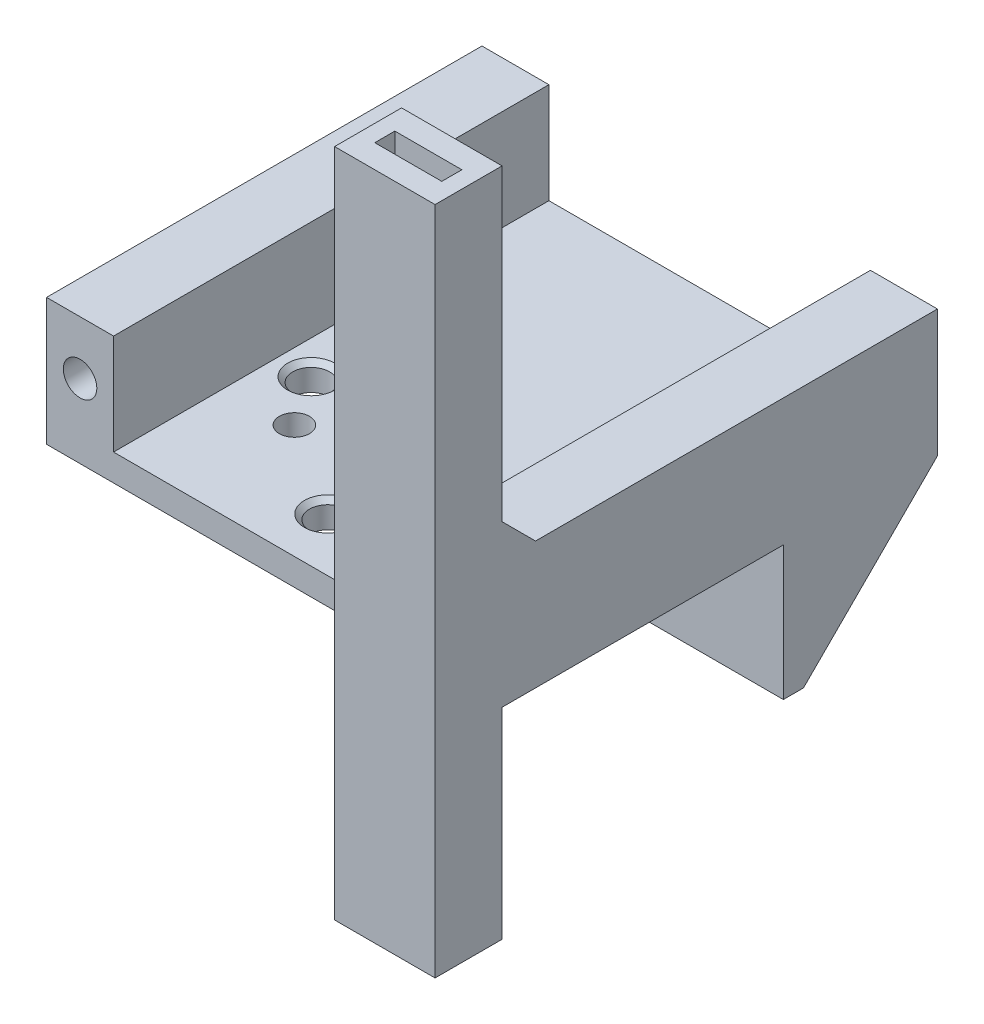
ISO-10303-21;
HEADER;
FILE_DESCRIPTION(('STEP AP214'),'2;1');
FILE_NAME('part.step','',(''),(''),'','','');
FILE_SCHEMA(('AUTOMOTIVE_DESIGN { 1 0 10303 214 1 1 1 1 }'));
ENDSEC;
DATA;
#1=APPLICATION_CONTEXT('core data for automotive mechanical design processes');
#2=APPLICATION_PROTOCOL_DEFINITION('international standard','automotive_design',2000,#1);
#3=PRODUCT_CONTEXT('',#1,'mechanical');
#4=PRODUCT('Part','Part','',(#3));
#5=PRODUCT_RELATED_PRODUCT_CATEGORY('part','',(#4));
#6=PRODUCT_DEFINITION_FORMATION('','',#4);
#7=PRODUCT_DEFINITION_CONTEXT('part definition',#1,'design');
#8=PRODUCT_DEFINITION('design','',#6,#7);
#9=PRODUCT_DEFINITION_SHAPE('','',#8);
#10=(LENGTH_UNIT() NAMED_UNIT(*) SI_UNIT(.MILLI.,.METRE.));
#11=(NAMED_UNIT(*) PLANE_ANGLE_UNIT() SI_UNIT($,.RADIAN.));
#12=(NAMED_UNIT(*) SI_UNIT($,.STERADIAN.) SOLID_ANGLE_UNIT());
#13=UNCERTAINTY_MEASURE_WITH_UNIT(LENGTH_MEASURE(1.E-05),#10,'distance_accuracy_value','');
#14=(GEOMETRIC_REPRESENTATION_CONTEXT(3) GLOBAL_UNCERTAINTY_ASSIGNED_CONTEXT((#13)) GLOBAL_UNIT_ASSIGNED_CONTEXT((#10,
#11,#12)) REPRESENTATION_CONTEXT('',''));
#15=CARTESIAN_POINT('',(0.,0.,0.));
#16=DIRECTION('',(0.,0.,1.));
#17=DIRECTION('',(1.,0.,0.));
#18=AXIS2_PLACEMENT_3D('',#15,#16,#17);
#19=CARTESIAN_POINT('',(-24.,19.,-40.));
#20=DIRECTION('',(-1.,0.,0.));
#21=DIRECTION('',(0.,0.,1.));
#22=AXIS2_PLACEMENT_3D('',#19,#20,#21);
#23=PLANE('',#22);
#24=DIRECTION('',(0.,0.,-1.));
#25=VECTOR('',#24,1.);
#26=CARTESIAN_POINT('',(-24.,4.,-40.));
#27=LINE('',#26,#25);
#28=CARTESIAN_POINT('',(-24.,4.,2.));
#29=VERTEX_POINT('',#28);
#30=CARTESIAN_POINT('',(-24.,4.,-63.));
#31=VERTEX_POINT('',#30);
#32=EDGE_CURVE('E56',#29,#31,#27,.T.);
#33=ORIENTED_EDGE('',*,*,#32,.T.);
#34=DIRECTION('',(0.,-1.,0.));
#35=VECTOR('',#34,1.);
#36=CARTESIAN_POINT('',(-24.,19.,-63.));
#37=LINE('',#36,#35);
#38=CARTESIAN_POINT('',(-24.,19.,-63.));
#39=VERTEX_POINT('',#38);
#40=EDGE_CURVE('E220',#39,#31,#37,.T.);
#41=ORIENTED_EDGE('',*,*,#40,.F.);
#42=DIRECTION('',(0.,0.,-1.));
#43=VECTOR('',#42,1.);
#44=CARTESIAN_POINT('',(-24.,19.,-40.));
#45=LINE('',#44,#43);
#46=CARTESIAN_POINT('',(-24.,19.,2.00000000000001));
#47=VERTEX_POINT('',#46);
#48=EDGE_CURVE('E318',#47,#39,#45,.T.);
#49=ORIENTED_EDGE('',*,*,#48,.F.);
#50=DIRECTION('',(0.,-1.,0.));
#51=VECTOR('',#50,1.);
#52=CARTESIAN_POINT('',(-24.,19.,2.00000000000001));
#53=LINE('',#52,#51);
#54=EDGE_CURVE('E320',#47,#29,#53,.T.);
#55=ORIENTED_EDGE('',*,*,#54,.T.);
#56=EDGE_LOOP('',(#33,#41,#49,#55));
#57=FACE_BOUND('',#56,.T.);
#58=ADVANCED_FACE('F33',(#57),#23,.F.);
#59=CARTESIAN_POINT('',(24.,19.,-40.));
#60=DIRECTION('',(1.,0.,0.));
#61=DIRECTION('',(0.,0.,-1.));
#62=AXIS2_PLACEMENT_3D('',#59,#60,#61);
#63=PLANE('',#62);
#64=DIRECTION('',(0.,1.,0.));
#65=VECTOR('',#64,1.);
#66=CARTESIAN_POINT('',(24.,19.,-63.));
#67=LINE('',#66,#65);
#68=CARTESIAN_POINT('',(24.,4.,-63.));
#69=VERTEX_POINT('',#68);
#70=CARTESIAN_POINT('',(24.,19.,-63.));
#71=VERTEX_POINT('',#70);
#72=EDGE_CURVE('E230',#69,#71,#67,.T.);
#73=ORIENTED_EDGE('',*,*,#72,.F.);
#74=DIRECTION('',(0.,0.,1.));
#75=VECTOR('',#74,1.);
#76=CARTESIAN_POINT('',(24.,4.,-40.));
#77=LINE('',#76,#75);
#78=CARTESIAN_POINT('',(24.,4.,-3.));
#79=VERTEX_POINT('',#78);
#80=EDGE_CURVE('E48',#69,#79,#77,.T.);
#81=ORIENTED_EDGE('',*,*,#80,.T.);
#82=DIRECTION('',(0.,1.,0.));
#83=VECTOR('',#82,1.);
#84=CARTESIAN_POINT('',(24.,19.,-3.));
#85=LINE('',#84,#83);
#86=CARTESIAN_POINT('',(24.,19.,-3.));
#87=VERTEX_POINT('',#86);
#88=EDGE_CURVE('E381',#79,#87,#85,.T.);
#89=ORIENTED_EDGE('',*,*,#88,.T.);
#90=DIRECTION('',(0.,0.,1.));
#91=VECTOR('',#90,1.);
#92=CARTESIAN_POINT('',(24.,19.,-40.));
#93=LINE('',#92,#91);
#94=EDGE_CURVE('E311',#71,#87,#93,.T.);
#95=ORIENTED_EDGE('',*,*,#94,.F.);
#96=EDGE_LOOP('',(#73,#81,#89,#95));
#97=FACE_BOUND('',#96,.T.);
#98=ADVANCED_FACE('F421',(#97),#63,.F.);
#99=CARTESIAN_POINT('',(19.,-30.,2.));
#100=DIRECTION('',(1.,0.,0.));
#101=DIRECTION('',(0.,0.,-1.));
#102=AXIS2_PLACEMENT_3D('',#99,#100,#101);
#103=PLANE('',#102);
#104=DIRECTION('',(0.,1.,0.));
#105=VECTOR('',#104,1.);
#106=CARTESIAN_POINT('',(19.,-30.,2.));
#107=LINE('',#106,#105);
#108=CARTESIAN_POINT('',(19.,4.,2.));
#109=VERTEX_POINT('',#108);
#110=CARTESIAN_POINT('',(19.,24.,2.));
#111=VERTEX_POINT('',#110);
#112=EDGE_CURVE('E296',#109,#111,#107,.T.);
#113=ORIENTED_EDGE('',*,*,#112,.F.);
#114=DIRECTION('',(0.,0.,1.));
#115=VECTOR('',#114,1.);
#116=CARTESIAN_POINT('',(19.,4.,0.));
#117=LINE('',#116,#115);
#118=CARTESIAN_POINT('',(19.,4.,12.));
#119=VERTEX_POINT('',#118);
#120=EDGE_CURVE('E389',#109,#119,#117,.T.);
#121=ORIENTED_EDGE('',*,*,#120,.T.);
#122=DIRECTION('',(0.,1.,0.));
#123=VECTOR('',#122,1.);
#124=CARTESIAN_POINT('',(19.,-30.,12.));
#125=LINE('',#124,#123);
#126=CARTESIAN_POINT('',(19.,70.,12.));
#127=VERTEX_POINT('',#126);
#128=EDGE_CURVE('E295',#119,#127,#125,.T.);
#129=ORIENTED_EDGE('',*,*,#128,.T.);
#130=DIRECTION('',(0.,0.,-1.));
#131=VECTOR('',#130,1.);
#132=CARTESIAN_POINT('',(19.,70.,2.));
#133=LINE('',#132,#131);
#134=CARTESIAN_POINT('',(19.,70.,2.));
#135=VERTEX_POINT('',#134);
#136=EDGE_CURVE('E272',#127,#135,#133,.T.);
#137=ORIENTED_EDGE('',*,*,#136,.T.);
#138=EDGE_CURVE('E291',#111,#135,#107,.T.);
#139=ORIENTED_EDGE('',*,*,#138,.F.);
#140=EDGE_LOOP('',(#113,#121,#129,#137,#139));
#141=FACE_BOUND('',#140,.T.);
#142=ADVANCED_FACE('F471',(#141),#103,.F.);
#143=CARTESIAN_POINT('',(0.,0.,0.));
#144=DIRECTION('',(0.,-1.,0.));
#145=DIRECTION('',(0.,0.,-1.));
#146=AXIS2_PLACEMENT_3D('',#143,#144,#145);
#147=PLANE('',#146);
#148=CARTESIAN_POINT('',(-14.,0.,-15.));
#149=DIRECTION('',(0.,1.,0.));
#150=DIRECTION('',(0.,0.,1.));
#151=AXIS2_PLACEMENT_3D('',#148,#149,#150);
#152=CIRCLE('',#151,2.25);
#153=CARTESIAN_POINT('',(-14.,0.,-12.75));
#154=VERTEX_POINT('',#153);
#155=EDGE_CURVE('E327',#154,#154,#152,.T.);
#156=ORIENTED_EDGE('',*,*,#155,.T.);
#157=EDGE_LOOP('',(#156));
#158=FACE_BOUND('',#157,.T.);
#159=CARTESIAN_POINT('',(19.,0.,-22.5));
#160=DIRECTION('',(0.,1.,0.));
#161=DIRECTION('',(0.,0.,1.));
#162=AXIS2_PLACEMENT_3D('',#159,#160,#161);
#163=CIRCLE('',#162,2.75);
#164=CARTESIAN_POINT('',(19.,0.,-19.75));
#165=VERTEX_POINT('',#164);
#166=EDGE_CURVE('E338',#165,#165,#163,.T.);
#167=ORIENTED_EDGE('',*,*,#166,.T.);
#168=EDGE_LOOP('',(#167));
#169=FACE_BOUND('',#168,.T.);
#170=CARTESIAN_POINT('',(-19.,0.,-22.5));
#171=DIRECTION('',(0.,1.,0.));
#172=DIRECTION('',(0.,0.,1.));
#173=AXIS2_PLACEMENT_3D('',#170,#171,#172);
#174=CIRCLE('',#173,2.75);
#175=CARTESIAN_POINT('',(-19.,0.,-19.75));
#176=VERTEX_POINT('',#175);
#177=EDGE_CURVE('E341',#176,#176,#174,.T.);
#178=ORIENTED_EDGE('',*,*,#177,.T.);
#179=EDGE_LOOP('',(#178));
#180=FACE_BOUND('',#179,.T.);
#181=CARTESIAN_POINT('',(0.,0.,-6.));
#182=DIRECTION('',(0.,1.,0.));
#183=DIRECTION('',(0.,0.,1.));
#184=AXIS2_PLACEMENT_3D('',#181,#182,#183);
#185=CIRCLE('',#184,2.75);
#186=CARTESIAN_POINT('',(0.,0.,-3.25));
#187=VERTEX_POINT('',#186);
#188=EDGE_CURVE('E333',#187,#187,#185,.T.);
#189=ORIENTED_EDGE('',*,*,#188,.T.);
#190=EDGE_LOOP('',(#189));
#191=FACE_BOUND('',#190,.T.);
#192=CARTESIAN_POINT('',(14.,0.,-15.));
#193=DIRECTION('',(0.,1.,0.));
#194=DIRECTION('',(0.,0.,1.));
#195=AXIS2_PLACEMENT_3D('',#192,#193,#194);
#196=CIRCLE('',#195,2.25);
#197=CARTESIAN_POINT('',(14.,0.,-12.75));
#198=VERTEX_POINT('',#197);
#199=EDGE_CURVE('E323',#198,#198,#196,.T.);
#200=ORIENTED_EDGE('',*,*,#199,.T.);
#201=EDGE_LOOP('',(#200));
#202=FACE_BOUND('',#201,.T.);
#203=DIRECTION('',(0.,0.,1.));
#204=VECTOR('',#203,1.);
#205=CARTESIAN_POINT('',(-34.,0.,0.));
#206=LINE('',#205,#204);
#207=CARTESIAN_POINT('',(-34.,0.,-40.));
#208=VERTEX_POINT('',#207);
#209=CARTESIAN_POINT('',(-34.,0.,2.));
#210=VERTEX_POINT('',#209);
#211=EDGE_CURVE('E351',#208,#210,#206,.T.);
#212=ORIENTED_EDGE('',*,*,#211,.F.);
#213=DIRECTION('',(-1.,0.,0.));
#214=VECTOR('',#213,1.);
#215=CARTESIAN_POINT('',(-34.,0.,-40.));
#216=LINE('',#215,#214);
#217=CARTESIAN_POINT('',(34.,0.,-40.));
#218=VERTEX_POINT('',#217);
#219=EDGE_CURVE('E344',#218,#208,#216,.T.);
#220=ORIENTED_EDGE('',*,*,#219,.F.);
#221=DIRECTION('',(0.,0.,-1.));
#222=VECTOR('',#221,1.);
#223=CARTESIAN_POINT('',(34.,0.,2.));
#224=LINE('',#223,#222);
#225=CARTESIAN_POINT('',(34.,0.,2.));
#226=VERTEX_POINT('',#225);
#227=EDGE_CURVE('E349',#226,#218,#224,.T.);
#228=ORIENTED_EDGE('',*,*,#227,.F.);
#229=DIRECTION('',(1.,0.,0.));
#230=VECTOR('',#229,1.);
#231=CARTESIAN_POINT('',(-34.,0.,2.));
#232=LINE('',#231,#230);
#233=CARTESIAN_POINT('',(19.,0.,2.));
#234=VERTEX_POINT('',#233);
#235=EDGE_CURVE('E353',#234,#226,#232,.T.);
#236=ORIENTED_EDGE('',*,*,#235,.F.);
#237=DIRECTION('',(0.,0.,-1.));
#238=VECTOR('',#237,1.);
#239=CARTESIAN_POINT('',(19.,0.,2.));
#240=LINE('',#239,#238);
#241=CARTESIAN_POINT('',(19.,0.,12.));
#242=VERTEX_POINT('',#241);
#243=EDGE_CURVE('E387',#242,#234,#240,.T.);
#244=ORIENTED_EDGE('',*,*,#243,.F.);
#245=DIRECTION('',(0.707106781186551,0.,0.707106781186544));
#246=VECTOR('',#245,1.);
#247=CARTESIAN_POINT('',(8.99999999999994,0.,2.));
#248=LINE('',#247,#246);
#249=CARTESIAN_POINT('',(8.99999999999994,0.,2.));
#250=VERTEX_POINT('',#249);
#251=EDGE_CURVE('E394',#242,#250,#248,.F.);
#252=ORIENTED_EDGE('',*,*,#251,.T.);
#253=EDGE_CURVE('E354',#210,#250,#232,.T.);
#254=ORIENTED_EDGE('',*,*,#253,.F.);
#255=EDGE_LOOP('',(#212,#220,#228,#236,#244,#252,#254));
#256=FACE_BOUND('',#255,.T.);
#257=ADVANCED_FACE('F498',(#158,#169,#180,#191,#202,#256),#147,.T.);
#258=CARTESIAN_POINT('',(0.,4.,0.));
#259=DIRECTION('',(0.,-1.,0.));
#260=DIRECTION('',(0.,0.,-1.));
#261=AXIS2_PLACEMENT_3D('',#258,#259,#260);
#262=PLANE('',#261);
#263=CARTESIAN_POINT('',(0.,4.,-6.));
#264=DIRECTION('',(0.,-1.,0.));
#265=DIRECTION('',(0.,0.,-1.));
#266=AXIS2_PLACEMENT_3D('',#263,#264,#265);
#267=CIRCLE('',#266,3.5);
#268=CARTESIAN_POINT('',(0.,4.,-9.5));
#269=VERTEX_POINT('',#268);
#270=EDGE_CURVE('E370',#269,#269,#267,.T.);
#271=ORIENTED_EDGE('',*,*,#270,.T.);
#272=EDGE_LOOP('',(#271));
#273=FACE_BOUND('',#272,.T.);
#274=CARTESIAN_POINT('',(-19.,4.,-22.5));
#275=DIRECTION('',(0.,-1.,0.));
#276=DIRECTION('',(0.,0.,-1.));
#277=AXIS2_PLACEMENT_3D('',#274,#275,#276);
#278=CIRCLE('',#277,3.5);
#279=CARTESIAN_POINT('',(-19.,4.,-26.));
#280=VERTEX_POINT('',#279);
#281=EDGE_CURVE('E367',#280,#280,#278,.T.);
#282=ORIENTED_EDGE('',*,*,#281,.T.);
#283=EDGE_LOOP('',(#282));
#284=FACE_BOUND('',#283,.T.);
#285=CARTESIAN_POINT('',(19.,4.,-22.5));
#286=DIRECTION('',(0.,-1.,0.));
#287=DIRECTION('',(0.,0.,-1.));
#288=AXIS2_PLACEMENT_3D('',#285,#286,#287);
#289=CIRCLE('',#288,3.5);
#290=CARTESIAN_POINT('',(19.,4.,-26.));
#291=VERTEX_POINT('',#290);
#292=EDGE_CURVE('E364',#291,#291,#289,.T.);
#293=ORIENTED_EDGE('',*,*,#292,.T.);
#294=EDGE_LOOP('',(#293));
#295=FACE_BOUND('',#294,.T.);
#296=CARTESIAN_POINT('',(-14.,4.,-15.));
#297=DIRECTION('',(0.,1.,0.));
#298=DIRECTION('',(0.,0.,1.));
#299=AXIS2_PLACEMENT_3D('',#296,#297,#298);
#300=CIRCLE('',#299,2.25);
#301=CARTESIAN_POINT('',(-14.,4.,-12.75));
#302=VERTEX_POINT('',#301);
#303=EDGE_CURVE('E330',#302,#302,#300,.T.);
#304=ORIENTED_EDGE('',*,*,#303,.F.);
#305=EDGE_LOOP('',(#304));
#306=FACE_BOUND('',#305,.T.);
#307=CARTESIAN_POINT('',(14.,4.,-15.));
#308=DIRECTION('',(0.,1.,0.));
#309=DIRECTION('',(0.,0.,1.));
#310=AXIS2_PLACEMENT_3D('',#307,#308,#309);
#311=CIRCLE('',#310,2.25);
#312=CARTESIAN_POINT('',(14.,4.,-12.75));
#313=VERTEX_POINT('',#312);
#314=EDGE_CURVE('E324',#313,#313,#311,.T.);
#315=ORIENTED_EDGE('',*,*,#314,.F.);
#316=EDGE_LOOP('',(#315));
#317=FACE_BOUND('',#316,.T.);
#318=DIRECTION('',(1.,0.,0.));
#319=VECTOR('',#318,1.);
#320=CARTESIAN_POINT('',(-34.,4.,2.));
#321=LINE('',#320,#319);
#322=CARTESIAN_POINT('',(8.99999999999994,4.,2.));
#323=VERTEX_POINT('',#322);
#324=EDGE_CURVE('E345',#29,#323,#321,.T.);
#325=ORIENTED_EDGE('',*,*,#324,.T.);
#326=DIRECTION('',(-0.707106781186551,0.,-0.707106781186544));
#327=VECTOR('',#326,1.);
#328=CARTESIAN_POINT('',(3.49999999999992,4.,-3.49999999999996));
#329=LINE('',#328,#327);
#330=EDGE_CURVE('E392',#323,#119,#329,.F.);
#331=ORIENTED_EDGE('',*,*,#330,.T.);
#332=ORIENTED_EDGE('',*,*,#120,.F.);
#333=DIRECTION('',(-0.707106781186551,0.,0.707106781186544));
#334=VECTOR('',#333,1.);
#335=CARTESIAN_POINT('',(19.,4.,2.));
#336=LINE('',#335,#334);
#337=EDGE_CURVE('E379',#109,#79,#336,.F.);
#338=ORIENTED_EDGE('',*,*,#337,.T.);
#339=ORIENTED_EDGE('',*,*,#80,.F.);
#340=DIRECTION('',(1.,0.,0.));
#341=VECTOR('',#340,1.);
#342=CARTESIAN_POINT('',(-34.002,4.,-63.));
#343=LINE('',#342,#341);
#344=EDGE_CURVE('E428',#31,#69,#343,.T.);
#345=ORIENTED_EDGE('',*,*,#344,.F.);
#346=ORIENTED_EDGE('',*,*,#32,.F.);
#347=EDGE_LOOP('',(#325,#331,#332,#338,#339,#345,#346));
#348=FACE_BOUND('',#347,.T.);
#349=ADVANCED_FACE('F496',(#273,#284,#295,#306,#317,#348),#262,.F.);
#350=CARTESIAN_POINT('',(-34.,4.,0.));
#351=DIRECTION('',(1.,0.,0.));
#352=DIRECTION('',(0.,0.,-1.));
#353=AXIS2_PLACEMENT_3D('',#350,#351,#352);
#354=PLANE('',#353);
#355=DIRECTION('',(0.,1.,0.));
#356=VECTOR('',#355,1.);
#357=CARTESIAN_POINT('',(-34.,19.,-63.));
#358=LINE('',#357,#356);
#359=CARTESIAN_POINT('',(-34.,0.,-63.));
#360=VERTEX_POINT('',#359);
#361=CARTESIAN_POINT('',(-34.,19.,-63.));
#362=VERTEX_POINT('',#361);
#363=EDGE_CURVE('E195',#360,#362,#358,.T.);
#364=ORIENTED_EDGE('',*,*,#363,.F.);
#365=DIRECTION('',(0.,-0.707106781186548,0.707106781186547));
#366=VECTOR('',#365,1.);
#367=CARTESIAN_POINT('',(-34.,0.,-63.));
#368=LINE('',#367,#366);
#369=CARTESIAN_POINT('',(-34.,-20.,-43.));
#370=VERTEX_POINT('',#369);
#371=EDGE_CURVE('E206',#360,#370,#368,.T.);
#372=ORIENTED_EDGE('',*,*,#371,.T.);
#373=DIRECTION('',(0.,0.,1.));
#374=VECTOR('',#373,1.);
#375=CARTESIAN_POINT('',(-34.,-20.,-43.));
#376=LINE('',#375,#374);
#377=CARTESIAN_POINT('',(-34.,-20.,-40.));
#378=VERTEX_POINT('',#377);
#379=EDGE_CURVE('E433',#370,#378,#376,.T.);
#380=ORIENTED_EDGE('',*,*,#379,.T.);
#381=DIRECTION('',(0.,1.,0.));
#382=VECTOR('',#381,1.);
#383=CARTESIAN_POINT('',(-34.,0.,-40.));
#384=LINE('',#383,#382);
#385=EDGE_CURVE('E434',#378,#208,#384,.T.);
#386=ORIENTED_EDGE('',*,*,#385,.T.);
#387=ORIENTED_EDGE('',*,*,#211,.T.);
#388=DIRECTION('',(0.,-1.,0.));
#389=VECTOR('',#388,1.);
#390=CARTESIAN_POINT('',(-34.,4.,2.));
#391=LINE('',#390,#389);
#392=CARTESIAN_POINT('',(-34.,19.,2.));
#393=VERTEX_POINT('',#392);
#394=EDGE_CURVE('E348',#393,#210,#391,.T.);
#395=ORIENTED_EDGE('',*,*,#394,.F.);
#396=DIRECTION('',(0.,0.,1.));
#397=VECTOR('',#396,1.);
#398=CARTESIAN_POINT('',(-34.,19.,-40.));
#399=LINE('',#398,#397);
#400=EDGE_CURVE('E218',#362,#393,#399,.T.);
#401=ORIENTED_EDGE('',*,*,#400,.F.);
#402=EDGE_LOOP('',(#364,#372,#380,#386,#387,#395,#401));
#403=FACE_BOUND('',#402,.T.);
#404=ADVANCED_FACE('F216',(#403),#354,.F.);
#405=CARTESIAN_POINT('',(-34.,4.,2.));
#406=DIRECTION('',(0.,0.,-1.));
#407=DIRECTION('',(-1.,0.,0.));
#408=AXIS2_PLACEMENT_3D('',#405,#406,#407);
#409=PLANE('',#408);
#410=CARTESIAN_POINT('',(-29.,11.,2.));
#411=DIRECTION('',(0.,0.,-1.));
#412=DIRECTION('',(-1.,0.,0.));
#413=AXIS2_PLACEMENT_3D('',#410,#411,#412);
#414=CIRCLE('',#413,2.49999999999999);
#415=CARTESIAN_POINT('',(-31.5,11.,2.));
#416=VERTEX_POINT('',#415);
#417=EDGE_CURVE('E303',#416,#416,#414,.T.);
#418=ORIENTED_EDGE('',*,*,#417,.T.);
#419=EDGE_LOOP('',(#418));
#420=FACE_BOUND('',#419,.T.);
#421=ORIENTED_EDGE('',*,*,#253,.T.);
#422=DIRECTION('',(0.,1.,0.));
#423=VECTOR('',#422,1.);
#424=CARTESIAN_POINT('',(8.99999999999994,4.,2.));
#425=LINE('',#424,#423);
#426=EDGE_CURVE('E384',#250,#323,#425,.T.);
#427=ORIENTED_EDGE('',*,*,#426,.T.);
#428=ORIENTED_EDGE('',*,*,#324,.F.);
#429=ORIENTED_EDGE('',*,*,#54,.F.);
#430=DIRECTION('',(1.,0.,0.));
#431=VECTOR('',#430,1.);
#432=CARTESIAN_POINT('',(-34.,19.,2.));
#433=LINE('',#432,#431);
#434=EDGE_CURVE('E316',#393,#47,#433,.T.);
#435=ORIENTED_EDGE('',*,*,#434,.F.);
#436=ORIENTED_EDGE('',*,*,#394,.T.);
#437=EDGE_LOOP('',(#421,#427,#428,#429,#435,#436));
#438=FACE_BOUND('',#437,.T.);
#439=ADVANCED_FACE('F505',(#420,#438),#409,.F.);
#440=CARTESIAN_POINT('',(34.,4.,2.));
#441=DIRECTION('',(-1.,0.,0.));
#442=DIRECTION('',(0.,0.,1.));
#443=AXIS2_PLACEMENT_3D('',#440,#441,#442);
#444=PLANE('',#443);
#445=DIRECTION('',(0.,0.707106781186548,-0.707106781186547));
#446=VECTOR('',#445,1.);
#447=CARTESIAN_POINT('',(34.,-20.,-43.));
#448=LINE('',#447,#446);
#449=CARTESIAN_POINT('',(34.,-20.,-43.));
#450=VERTEX_POINT('',#449);
#451=CARTESIAN_POINT('',(34.,0.,-63.));
#452=VERTEX_POINT('',#451);
#453=EDGE_CURVE('E214',#450,#452,#448,.T.);
#454=ORIENTED_EDGE('',*,*,#453,.T.);
#455=DIRECTION('',(0.,-1.,0.));
#456=VECTOR('',#455,1.);
#457=CARTESIAN_POINT('',(34.,19.,-63.));
#458=LINE('',#457,#456);
#459=CARTESIAN_POINT('',(34.,19.,-63.));
#460=VERTEX_POINT('',#459);
#461=EDGE_CURVE('E199',#460,#452,#458,.T.);
#462=ORIENTED_EDGE('',*,*,#461,.F.);
#463=DIRECTION('',(0.,0.,-1.));
#464=VECTOR('',#463,1.);
#465=CARTESIAN_POINT('',(34.,19.,-40.));
#466=LINE('',#465,#464);
#467=CARTESIAN_POINT('',(34.,19.,-3.00000000000003));
#468=VERTEX_POINT('',#467);
#469=EDGE_CURVE('E309',#468,#460,#466,.T.);
#470=ORIENTED_EDGE('',*,*,#469,.F.);
#471=DIRECTION('',(0.,-0.707106781186544,-0.707106781186551));
#472=VECTOR('',#471,1.);
#473=CARTESIAN_POINT('',(34.,14.0000000000001,-7.99999999999999));
#474=LINE('',#473,#472);
#475=CARTESIAN_POINT('',(34.,24.,2.));
#476=VERTEX_POINT('',#475);
#477=EDGE_CURVE('E41',#468,#476,#474,.F.);
#478=ORIENTED_EDGE('',*,*,#477,.T.);
#479=DIRECTION('',(0.,1.,0.));
#480=VECTOR('',#479,1.);
#481=CARTESIAN_POINT('',(34.,-30.,2.));
#482=LINE('',#481,#480);
#483=CARTESIAN_POINT('',(34.,70.,2.));
#484=VERTEX_POINT('',#483);
#485=EDGE_CURVE('E287',#476,#484,#482,.T.);
#486=ORIENTED_EDGE('',*,*,#485,.T.);
#487=DIRECTION('',(0.,0.,1.));
#488=VECTOR('',#487,1.);
#489=CARTESIAN_POINT('',(34.,70.,2.));
#490=LINE('',#489,#488);
#491=CARTESIAN_POINT('',(34.,70.,12.));
#492=VERTEX_POINT('',#491);
#493=EDGE_CURVE('E260',#484,#492,#490,.T.);
#494=ORIENTED_EDGE('',*,*,#493,.T.);
#495=DIRECTION('',(0.,1.,0.));
#496=VECTOR('',#495,1.);
#497=CARTESIAN_POINT('',(34.,-30.,12.));
#498=LINE('',#497,#496);
#499=CARTESIAN_POINT('',(34.,-30.,12.));
#500=VERTEX_POINT('',#499);
#501=EDGE_CURVE('E300',#500,#492,#498,.T.);
#502=ORIENTED_EDGE('',*,*,#501,.F.);
#503=DIRECTION('',(0.,0.,1.));
#504=VECTOR('',#503,1.);
#505=CARTESIAN_POINT('',(34.,-30.,2.));
#506=LINE('',#505,#504);
#507=CARTESIAN_POINT('',(34.,-30.,2.));
#508=VERTEX_POINT('',#507);
#509=EDGE_CURVE('E278',#508,#500,#506,.T.);
#510=ORIENTED_EDGE('',*,*,#509,.F.);
#511=EDGE_CURVE('E288',#508,#226,#482,.T.);
#512=ORIENTED_EDGE('',*,*,#511,.T.);
#513=ORIENTED_EDGE('',*,*,#227,.T.);
#514=DIRECTION('',(0.,-1.,0.));
#515=VECTOR('',#514,1.);
#516=CARTESIAN_POINT('',(34.,-20.,-40.));
#517=LINE('',#516,#515);
#518=CARTESIAN_POINT('',(34.,-20.,-40.));
#519=VERTEX_POINT('',#518);
#520=EDGE_CURVE('E213',#218,#519,#517,.T.);
#521=ORIENTED_EDGE('',*,*,#520,.T.);
#522=DIRECTION('',(0.,0.,1.));
#523=VECTOR('',#522,1.);
#524=CARTESIAN_POINT('',(34.,-20.,-43.));
#525=LINE('',#524,#523);
#526=EDGE_CURVE('E427',#450,#519,#525,.T.);
#527=ORIENTED_EDGE('',*,*,#526,.F.);
#528=EDGE_LOOP('',(#454,#462,#470,#478,#486,#494,#502,#510,#512,#513,#521,#527));
#529=FACE_BOUND('',#528,.T.);
#530=ADVANCED_FACE('F404',(#529),#444,.F.);
#531=CARTESIAN_POINT('',(-19.,4.,-22.5));
#532=DIRECTION('',(0.,-1.,0.));
#533=DIRECTION('',(0.,0.,-1.));
#534=AXIS2_PLACEMENT_3D('',#531,#532,#533);
#535=CYLINDRICAL_SURFACE('',#534,2.75);
#536=CARTESIAN_POINT('',(-19.,3.25000000000001,-22.5));
#537=DIRECTION('',(0.,-1.,0.));
#538=DIRECTION('',(0.,0.,-1.));
#539=AXIS2_PLACEMENT_3D('',#536,#537,#538);
#540=CIRCLE('',#539,2.75);
#541=CARTESIAN_POINT('',(-19.,3.25000000000001,-25.25));
#542=VERTEX_POINT('',#541);
#543=EDGE_CURVE('E373',#542,#542,#540,.F.);
#544=ORIENTED_EDGE('',*,*,#543,.T.);
#545=EDGE_LOOP('',(#544));
#546=FACE_BOUND('',#545,.T.);
#547=ORIENTED_EDGE('',*,*,#177,.F.);
#548=EDGE_LOOP('',(#547));
#549=FACE_BOUND('',#548,.T.);
#550=ADVANCED_FACE('F491',(#546,#549),#535,.F.);
#551=CARTESIAN_POINT('',(19.,4.,-22.5));
#552=DIRECTION('',(0.,-1.,0.));
#553=DIRECTION('',(0.,0.,-1.));
#554=AXIS2_PLACEMENT_3D('',#551,#552,#553);
#555=CYLINDRICAL_SURFACE('',#554,2.75);
#556=CARTESIAN_POINT('',(19.,3.25000000000001,-22.5));
#557=DIRECTION('',(0.,-1.,0.));
#558=DIRECTION('',(0.,0.,-1.));
#559=AXIS2_PLACEMENT_3D('',#556,#557,#558);
#560=CIRCLE('',#559,2.75);
#561=CARTESIAN_POINT('',(19.,3.25000000000001,-25.25));
#562=VERTEX_POINT('',#561);
#563=EDGE_CURVE('E376',#562,#562,#560,.F.);
#564=ORIENTED_EDGE('',*,*,#563,.T.);
#565=EDGE_LOOP('',(#564));
#566=FACE_BOUND('',#565,.T.);
#567=ORIENTED_EDGE('',*,*,#166,.F.);
#568=EDGE_LOOP('',(#567));
#569=FACE_BOUND('',#568,.T.);
#570=ADVANCED_FACE('F487',(#566,#569),#555,.F.);
#571=CARTESIAN_POINT('',(0.,4.,-6.));
#572=DIRECTION('',(0.,-1.,0.));
#573=DIRECTION('',(0.,0.,-1.));
#574=AXIS2_PLACEMENT_3D('',#571,#572,#573);
#575=CYLINDRICAL_SURFACE('',#574,2.75);
#576=CARTESIAN_POINT('',(0.,3.25000000000002,-6.));
#577=DIRECTION('',(0.,-1.,0.));
#578=DIRECTION('',(0.,0.,-1.));
#579=AXIS2_PLACEMENT_3D('',#576,#577,#578);
#580=CIRCLE('',#579,2.75);
#581=CARTESIAN_POINT('',(0.,3.25000000000002,-8.75));
#582=VERTEX_POINT('',#581);
#583=EDGE_CURVE('E361',#582,#582,#580,.F.);
#584=ORIENTED_EDGE('',*,*,#583,.T.);
#585=EDGE_LOOP('',(#584));
#586=FACE_BOUND('',#585,.T.);
#587=ORIENTED_EDGE('',*,*,#188,.F.);
#588=EDGE_LOOP('',(#587));
#589=FACE_BOUND('',#588,.T.);
#590=ADVANCED_FACE('F483',(#586,#589),#575,.F.);
#591=CARTESIAN_POINT('',(-14.,4.,-15.));
#592=DIRECTION('',(0.,-1.,0.));
#593=DIRECTION('',(0.,0.,-1.));
#594=AXIS2_PLACEMENT_3D('',#591,#592,#593);
#595=CYLINDRICAL_SURFACE('',#594,2.25);
#596=ORIENTED_EDGE('',*,*,#303,.T.);
#597=EDGE_LOOP('',(#596));
#598=FACE_BOUND('',#597,.T.);
#599=ORIENTED_EDGE('',*,*,#155,.F.);
#600=EDGE_LOOP('',(#599));
#601=FACE_BOUND('',#600,.T.);
#602=ADVANCED_FACE('F479',(#598,#601),#595,.F.);
#603=CARTESIAN_POINT('',(14.,4.,-15.));
#604=DIRECTION('',(0.,-1.,0.));
#605=DIRECTION('',(0.,0.,-1.));
#606=AXIS2_PLACEMENT_3D('',#603,#604,#605);
#607=CYLINDRICAL_SURFACE('',#606,2.25);
#608=ORIENTED_EDGE('',*,*,#314,.T.);
#609=EDGE_LOOP('',(#608));
#610=FACE_BOUND('',#609,.T.);
#611=ORIENTED_EDGE('',*,*,#199,.F.);
#612=EDGE_LOOP('',(#611));
#613=FACE_BOUND('',#612,.T.);
#614=ADVANCED_FACE('F476',(#610,#613),#607,.F.);
#615=CARTESIAN_POINT('',(0.,19.,0.));
#616=DIRECTION('',(0.,1.,0.));
#617=DIRECTION('',(0.,0.,1.));
#618=AXIS2_PLACEMENT_3D('',#615,#616,#617);
#619=PLANE('',#618);
#620=ORIENTED_EDGE('',*,*,#400,.T.);
#621=ORIENTED_EDGE('',*,*,#434,.T.);
#622=ORIENTED_EDGE('',*,*,#48,.T.);
#623=DIRECTION('',(1.,0.,0.));
#624=VECTOR('',#623,1.);
#625=CARTESIAN_POINT('',(-24.,19.,-63.));
#626=LINE('',#625,#624);
#627=EDGE_CURVE('E219',#362,#39,#626,.T.);
#628=ORIENTED_EDGE('',*,*,#627,.F.);
#629=EDGE_LOOP('',(#620,#621,#622,#628));
#630=FACE_BOUND('',#629,.T.);
#631=ADVANCED_FACE('F475',(#630),#619,.T.);
#632=CARTESIAN_POINT('',(0.,19.,0.));
#633=DIRECTION('',(0.,-1.,0.));
#634=DIRECTION('',(0.,0.,-1.));
#635=AXIS2_PLACEMENT_3D('',#632,#633,#634);
#636=PLANE('',#635);
#637=ORIENTED_EDGE('',*,*,#94,.T.);
#638=DIRECTION('',(1.,0.,0.));
#639=VECTOR('',#638,1.);
#640=CARTESIAN_POINT('',(34.,19.,-3.00000000000003));
#641=LINE('',#640,#639);
#642=EDGE_CURVE('E396',#87,#468,#641,.T.);
#643=ORIENTED_EDGE('',*,*,#642,.T.);
#644=ORIENTED_EDGE('',*,*,#469,.T.);
#645=DIRECTION('',(1.,0.,0.));
#646=VECTOR('',#645,1.);
#647=CARTESIAN_POINT('',(24.,19.,-63.));
#648=LINE('',#647,#646);
#649=EDGE_CURVE('E232',#71,#460,#648,.T.);
#650=ORIENTED_EDGE('',*,*,#649,.F.);
#651=EDGE_LOOP('',(#637,#643,#644,#650));
#652=FACE_BOUND('',#651,.T.);
#653=ADVANCED_FACE('F424',(#652),#636,.F.);
#654=CARTESIAN_POINT('',(-29.,11.,2.));
#655=DIRECTION('',(0.,0.,-1.));
#656=DIRECTION('',(-1.,0.,0.));
#657=AXIS2_PLACEMENT_3D('',#654,#655,#656);
#658=CYLINDRICAL_SURFACE('',#657,2.49999999999999);
#659=ORIENTED_EDGE('',*,*,#417,.F.);
#660=EDGE_LOOP('',(#659));
#661=FACE_BOUND('',#660,.T.);
#662=CARTESIAN_POINT('',(-29.,11.,-63.));
#663=DIRECTION('',(0.,0.,-1.));
#664=DIRECTION('',(-1.,0.,0.));
#665=AXIS2_PLACEMENT_3D('',#662,#663,#664);
#666=CIRCLE('',#665,2.49999999999999);
#667=CARTESIAN_POINT('',(-31.5,11.,-63.));
#668=VERTEX_POINT('',#667);
#669=EDGE_CURVE('E224',#668,#668,#666,.T.);
#670=ORIENTED_EDGE('',*,*,#669,.T.);
#671=EDGE_LOOP('',(#670));
#672=FACE_BOUND('',#671,.T.);
#673=ADVANCED_FACE('F444',(#661,#672),#658,.F.);
#674=CARTESIAN_POINT('',(0.,3.25000000000002,-6.));
#675=DIRECTION('',(0.,1.,0.));
#676=DIRECTION('',(0.,0.,1.));
#677=AXIS2_PLACEMENT_3D('',#674,#675,#676);
#678=CONICAL_SURFACE('',#677,2.75,0.785398163397457);
#679=ORIENTED_EDGE('',*,*,#270,.F.);
#680=EDGE_LOOP('',(#679));
#681=FACE_BOUND('',#680,.T.);
#682=ORIENTED_EDGE('',*,*,#583,.F.);
#683=EDGE_LOOP('',(#682));
#684=FACE_BOUND('',#683,.T.);
#685=ADVANCED_FACE('F511',(#681,#684),#678,.F.);
#686=CARTESIAN_POINT('',(-19.,3.25000000000001,-22.5));
#687=DIRECTION('',(0.,1.,0.));
#688=DIRECTION('',(0.,0.,1.));
#689=AXIS2_PLACEMENT_3D('',#686,#687,#688);
#690=CONICAL_SURFACE('',#689,2.75,0.785398163397456);
#691=ORIENTED_EDGE('',*,*,#281,.F.);
#692=EDGE_LOOP('',(#691));
#693=FACE_BOUND('',#692,.T.);
#694=ORIENTED_EDGE('',*,*,#543,.F.);
#695=EDGE_LOOP('',(#694));
#696=FACE_BOUND('',#695,.T.);
#697=ADVANCED_FACE('F514',(#693,#696),#690,.F.);
#698=CARTESIAN_POINT('',(19.,3.25000000000001,-22.5));
#699=DIRECTION('',(0.,1.,0.));
#700=DIRECTION('',(0.,0.,1.));
#701=AXIS2_PLACEMENT_3D('',#698,#699,#700);
#702=CONICAL_SURFACE('',#701,2.75,0.785398163397456);
#703=ORIENTED_EDGE('',*,*,#292,.F.);
#704=EDGE_LOOP('',(#703));
#705=FACE_BOUND('',#704,.T.);
#706=ORIENTED_EDGE('',*,*,#563,.F.);
#707=EDGE_LOOP('',(#706));
#708=FACE_BOUND('',#707,.T.);
#709=ADVANCED_FACE('F518',(#705,#708),#702,.F.);
#710=CARTESIAN_POINT('',(0.,70.,0.));
#711=DIRECTION('',(0.,-1.,0.));
#712=DIRECTION('',(0.,0.,-1.));
#713=AXIS2_PLACEMENT_3D('',#710,#711,#712);
#714=PLANE('',#713);
#715=DIRECTION('',(-1.,0.,0.));
#716=VECTOR('',#715,1.);
#717=CARTESIAN_POINT('',(21.5,70.,5.5));
#718=LINE('',#717,#716);
#719=CARTESIAN_POINT('',(31.5,70.,5.5));
#720=VERTEX_POINT('',#719);
#721=CARTESIAN_POINT('',(21.5,70.,5.5));
#722=VERTEX_POINT('',#721);
#723=EDGE_CURVE('E250',#720,#722,#718,.T.);
#724=ORIENTED_EDGE('',*,*,#723,.F.);
#725=DIRECTION('',(0.,0.,-1.));
#726=VECTOR('',#725,1.);
#727=CARTESIAN_POINT('',(31.5,70.,5.5));
#728=LINE('',#727,#726);
#729=CARTESIAN_POINT('',(31.5,70.,8.5));
#730=VERTEX_POINT('',#729);
#731=EDGE_CURVE('E203',#730,#720,#728,.T.);
#732=ORIENTED_EDGE('',*,*,#731,.F.);
#733=DIRECTION('',(1.,0.,0.));
#734=VECTOR('',#733,1.);
#735=CARTESIAN_POINT('',(21.5,70.,8.5));
#736=LINE('',#735,#734);
#737=CARTESIAN_POINT('',(21.5,70.,8.5));
#738=VERTEX_POINT('',#737);
#739=EDGE_CURVE('E239',#738,#730,#736,.T.);
#740=ORIENTED_EDGE('',*,*,#739,.F.);
#741=DIRECTION('',(0.,0.,1.));
#742=VECTOR('',#741,1.);
#743=CARTESIAN_POINT('',(21.5,70.,5.5));
#744=LINE('',#743,#742);
#745=EDGE_CURVE('E253',#722,#738,#744,.T.);
#746=ORIENTED_EDGE('',*,*,#745,.F.);
#747=EDGE_LOOP('',(#724,#732,#740,#746));
#748=FACE_BOUND('',#747,.T.);
#749=ORIENTED_EDGE('',*,*,#493,.F.);
#750=DIRECTION('',(1.,0.,0.));
#751=VECTOR('',#750,1.);
#752=CARTESIAN_POINT('',(34.,70.,2.));
#753=LINE('',#752,#751);
#754=EDGE_CURVE('E275',#135,#484,#753,.T.);
#755=ORIENTED_EDGE('',*,*,#754,.F.);
#756=ORIENTED_EDGE('',*,*,#136,.F.);
#757=DIRECTION('',(-1.,0.,0.));
#758=VECTOR('',#757,1.);
#759=CARTESIAN_POINT('',(34.,70.,12.));
#760=LINE('',#759,#758);
#761=EDGE_CURVE('E269',#492,#127,#760,.T.);
#762=ORIENTED_EDGE('',*,*,#761,.F.);
#763=EDGE_LOOP('',(#749,#755,#756,#762));
#764=FACE_BOUND('',#763,.T.);
#765=ADVANCED_FACE('F522',(#748,#764),#714,.F.);
#766=CARTESIAN_POINT('',(0.,-30.,0.));
#767=DIRECTION('',(0.,-1.,0.));
#768=DIRECTION('',(0.,0.,-1.));
#769=AXIS2_PLACEMENT_3D('',#766,#767,#768);
#770=PLANE('',#769);
#771=DIRECTION('',(0.,0.,-1.));
#772=VECTOR('',#771,1.);
#773=CARTESIAN_POINT('',(31.5,-30.,5.5));
#774=LINE('',#773,#772);
#775=CARTESIAN_POINT('',(31.5,-30.,8.5));
#776=VERTEX_POINT('',#775);
#777=CARTESIAN_POINT('',(31.5,-30.,5.5));
#778=VERTEX_POINT('',#777);
#779=EDGE_CURVE('E235',#776,#778,#774,.T.);
#780=ORIENTED_EDGE('',*,*,#779,.T.);
#781=DIRECTION('',(-1.,0.,0.));
#782=VECTOR('',#781,1.);
#783=CARTESIAN_POINT('',(21.5,-30.,5.5));
#784=LINE('',#783,#782);
#785=CARTESIAN_POINT('',(21.5,-30.,5.5));
#786=VERTEX_POINT('',#785);
#787=EDGE_CURVE('E238',#778,#786,#784,.T.);
#788=ORIENTED_EDGE('',*,*,#787,.T.);
#789=DIRECTION('',(0.,0.,1.));
#790=VECTOR('',#789,1.);
#791=CARTESIAN_POINT('',(21.5,-30.,5.5));
#792=LINE('',#791,#790);
#793=CARTESIAN_POINT('',(21.5,-30.,8.5));
#794=VERTEX_POINT('',#793);
#795=EDGE_CURVE('E242',#786,#794,#792,.T.);
#796=ORIENTED_EDGE('',*,*,#795,.T.);
#797=DIRECTION('',(1.,0.,0.));
#798=VECTOR('',#797,1.);
#799=CARTESIAN_POINT('',(21.5,-30.,8.5));
#800=LINE('',#799,#798);
#801=EDGE_CURVE('E245',#794,#776,#800,.T.);
#802=ORIENTED_EDGE('',*,*,#801,.T.);
#803=EDGE_LOOP('',(#780,#788,#796,#802));
#804=FACE_BOUND('',#803,.T.);
#805=ORIENTED_EDGE('',*,*,#509,.T.);
#806=DIRECTION('',(-1.,0.,0.));
#807=VECTOR('',#806,1.);
#808=CARTESIAN_POINT('',(34.,-30.,12.));
#809=LINE('',#808,#807);
#810=CARTESIAN_POINT('',(19.,-30.,12.));
#811=VERTEX_POINT('',#810);
#812=EDGE_CURVE('E281',#500,#811,#809,.T.);
#813=ORIENTED_EDGE('',*,*,#812,.T.);
#814=DIRECTION('',(0.,0.,-1.));
#815=VECTOR('',#814,1.);
#816=CARTESIAN_POINT('',(19.,-30.,2.));
#817=LINE('',#816,#815);
#818=CARTESIAN_POINT('',(19.,-30.,2.));
#819=VERTEX_POINT('',#818);
#820=EDGE_CURVE('E283',#811,#819,#817,.T.);
#821=ORIENTED_EDGE('',*,*,#820,.T.);
#822=DIRECTION('',(1.,0.,0.));
#823=VECTOR('',#822,1.);
#824=CARTESIAN_POINT('',(34.,-30.,2.));
#825=LINE('',#824,#823);
#826=EDGE_CURVE('E285',#819,#508,#825,.T.);
#827=ORIENTED_EDGE('',*,*,#826,.T.);
#828=EDGE_LOOP('',(#805,#813,#821,#827));
#829=FACE_BOUND('',#828,.T.);
#830=ADVANCED_FACE('F567',(#804,#829),#770,.T.);
#831=CARTESIAN_POINT('',(34.,-30.,2.));
#832=DIRECTION('',(0.,0.,1.));
#833=DIRECTION('',(1.,0.,0.));
#834=AXIS2_PLACEMENT_3D('',#831,#832,#833);
#835=PLANE('',#834);
#836=ORIENTED_EDGE('',*,*,#485,.F.);
#837=DIRECTION('',(-1.,0.,0.));
#838=VECTOR('',#837,1.);
#839=CARTESIAN_POINT('',(19.,24.,2.));
#840=LINE('',#839,#838);
#841=EDGE_CURVE('E399',#476,#111,#840,.T.);
#842=ORIENTED_EDGE('',*,*,#841,.T.);
#843=ORIENTED_EDGE('',*,*,#138,.T.);
#844=ORIENTED_EDGE('',*,*,#754,.T.);
#845=EDGE_LOOP('',(#836,#842,#843,#844));
#846=FACE_BOUND('',#845,.T.);
#847=ADVANCED_FACE('F410',(#846),#835,.F.);
#848=EDGE_CURVE('E297',#811,#242,#125,.T.);
#849=ORIENTED_EDGE('',*,*,#848,.T.);
#850=ORIENTED_EDGE('',*,*,#243,.T.);
#851=EDGE_CURVE('E292',#819,#234,#107,.T.);
#852=ORIENTED_EDGE('',*,*,#851,.F.);
#853=ORIENTED_EDGE('',*,*,#820,.F.);
#854=EDGE_LOOP('',(#849,#850,#852,#853));
#855=FACE_BOUND('',#854,.T.);
#856=ADVANCED_FACE('F557',(#855),#103,.F.);
#857=CARTESIAN_POINT('',(34.,-30.,12.));
#858=DIRECTION('',(0.,0.,-1.));
#859=DIRECTION('',(-1.,0.,0.));
#860=AXIS2_PLACEMENT_3D('',#857,#858,#859);
#861=PLANE('',#860);
#862=ORIENTED_EDGE('',*,*,#501,.T.);
#863=ORIENTED_EDGE('',*,*,#761,.T.);
#864=ORIENTED_EDGE('',*,*,#128,.F.);
#865=EDGE_CURVE('E301',#242,#119,#125,.T.);
#866=ORIENTED_EDGE('',*,*,#865,.F.);
#867=ORIENTED_EDGE('',*,*,#848,.F.);
#868=ORIENTED_EDGE('',*,*,#812,.F.);
#869=EDGE_LOOP('',(#862,#863,#864,#866,#867,#868));
#870=FACE_BOUND('',#869,.T.);
#871=ADVANCED_FACE('F560',(#870),#861,.F.);
#872=ORIENTED_EDGE('',*,*,#851,.T.);
#873=ORIENTED_EDGE('',*,*,#235,.T.);
#874=ORIENTED_EDGE('',*,*,#511,.F.);
#875=ORIENTED_EDGE('',*,*,#826,.F.);
#876=EDGE_LOOP('',(#872,#873,#874,#875));
#877=FACE_BOUND('',#876,.T.);
#878=ADVANCED_FACE('F458',(#877),#835,.F.);
#879=CARTESIAN_POINT('',(31.5,-30.,5.5));
#880=DIRECTION('',(1.,0.,0.));
#881=DIRECTION('',(0.,0.,-1.));
#882=AXIS2_PLACEMENT_3D('',#879,#880,#881);
#883=PLANE('',#882);
#884=ORIENTED_EDGE('',*,*,#731,.T.);
#885=DIRECTION('',(0.,1.,0.));
#886=VECTOR('',#885,1.);
#887=CARTESIAN_POINT('',(31.5,-30.,5.5));
#888=LINE('',#887,#886);
#889=EDGE_CURVE('E248',#778,#720,#888,.T.);
#890=ORIENTED_EDGE('',*,*,#889,.F.);
#891=ORIENTED_EDGE('',*,*,#779,.F.);
#892=DIRECTION('',(0.,1.,0.));
#893=VECTOR('',#892,1.);
#894=CARTESIAN_POINT('',(31.5,-30.,8.5));
#895=LINE('',#894,#893);
#896=EDGE_CURVE('E258',#776,#730,#895,.T.);
#897=ORIENTED_EDGE('',*,*,#896,.T.);
#898=EDGE_LOOP('',(#884,#890,#891,#897));
#899=FACE_BOUND('',#898,.T.);
#900=ADVANCED_FACE('F577',(#899),#883,.F.);
#901=CARTESIAN_POINT('',(21.5,-30.,8.5));
#902=DIRECTION('',(0.,0.,1.));
#903=DIRECTION('',(1.,0.,0.));
#904=AXIS2_PLACEMENT_3D('',#901,#902,#903);
#905=PLANE('',#904);
#906=ORIENTED_EDGE('',*,*,#739,.T.);
#907=ORIENTED_EDGE('',*,*,#896,.F.);
#908=ORIENTED_EDGE('',*,*,#801,.F.);
#909=DIRECTION('',(0.,1.,0.));
#910=VECTOR('',#909,1.);
#911=CARTESIAN_POINT('',(21.5,-30.,8.5));
#912=LINE('',#911,#910);
#913=EDGE_CURVE('E261',#794,#738,#912,.T.);
#914=ORIENTED_EDGE('',*,*,#913,.T.);
#915=EDGE_LOOP('',(#906,#907,#908,#914));
#916=FACE_BOUND('',#915,.T.);
#917=ADVANCED_FACE('F687',(#916),#905,.F.);
#918=CARTESIAN_POINT('',(21.5,-30.,5.5));
#919=DIRECTION('',(-1.,0.,0.));
#920=DIRECTION('',(0.,0.,1.));
#921=AXIS2_PLACEMENT_3D('',#918,#919,#920);
#922=PLANE('',#921);
#923=ORIENTED_EDGE('',*,*,#745,.T.);
#924=ORIENTED_EDGE('',*,*,#913,.F.);
#925=ORIENTED_EDGE('',*,*,#795,.F.);
#926=DIRECTION('',(0.,1.,0.));
#927=VECTOR('',#926,1.);
#928=CARTESIAN_POINT('',(21.5,-30.,5.5));
#929=LINE('',#928,#927);
#930=EDGE_CURVE('E263',#786,#722,#929,.T.);
#931=ORIENTED_EDGE('',*,*,#930,.T.);
#932=EDGE_LOOP('',(#923,#924,#925,#931));
#933=FACE_BOUND('',#932,.T.);
#934=ADVANCED_FACE('F460',(#933),#922,.F.);
#935=CARTESIAN_POINT('',(21.5,-30.,5.5));
#936=DIRECTION('',(0.,0.,-1.));
#937=DIRECTION('',(-1.,0.,0.));
#938=AXIS2_PLACEMENT_3D('',#935,#936,#937);
#939=PLANE('',#938);
#940=ORIENTED_EDGE('',*,*,#723,.T.);
#941=ORIENTED_EDGE('',*,*,#930,.F.);
#942=ORIENTED_EDGE('',*,*,#787,.F.);
#943=ORIENTED_EDGE('',*,*,#889,.T.);
#944=EDGE_LOOP('',(#940,#941,#942,#943));
#945=FACE_BOUND('',#944,.T.);
#946=ADVANCED_FACE('F448',(#945),#939,.F.);
#947=CARTESIAN_POINT('',(0.,0.,-63.));
#948=DIRECTION('',(0.,0.,1.));
#949=DIRECTION('',(1.,0.,0.));
#950=AXIS2_PLACEMENT_3D('',#947,#948,#949);
#951=PLANE('',#950);
#952=DIRECTION('',(-1.,0.,0.));
#953=VECTOR('',#952,1.);
#954=CARTESIAN_POINT('',(24.,0.,-63.));
#955=LINE('',#954,#953);
#956=EDGE_CURVE('E189',#452,#360,#955,.T.);
#957=ORIENTED_EDGE('',*,*,#956,.T.);
#958=ORIENTED_EDGE('',*,*,#363,.T.);
#959=ORIENTED_EDGE('',*,*,#627,.T.);
#960=ORIENTED_EDGE('',*,*,#40,.T.);
#961=ORIENTED_EDGE('',*,*,#344,.T.);
#962=ORIENTED_EDGE('',*,*,#72,.T.);
#963=ORIENTED_EDGE('',*,*,#649,.T.);
#964=ORIENTED_EDGE('',*,*,#461,.T.);
#965=EDGE_LOOP('',(#957,#958,#959,#960,#961,#962,#963,#964));
#966=FACE_BOUND('',#965,.T.);
#967=CARTESIAN_POINT('',(29.,11.,-63.));
#968=DIRECTION('',(0.,0.,-1.));
#969=DIRECTION('',(-1.,0.,0.));
#970=AXIS2_PLACEMENT_3D('',#967,#968,#969);
#971=CIRCLE('',#970,2.49999999999996);
#972=CARTESIAN_POINT('',(26.5,11.,-63.));
#973=VERTEX_POINT('',#972);
#974=EDGE_CURVE('E222',#973,#973,#971,.T.);
#975=ORIENTED_EDGE('',*,*,#974,.F.);
#976=EDGE_LOOP('',(#975));
#977=FACE_BOUND('',#976,.T.);
#978=ORIENTED_EDGE('',*,*,#669,.F.);
#979=EDGE_LOOP('',(#978));
#980=FACE_BOUND('',#979,.T.);
#981=ADVANCED_FACE('F191',(#966,#977,#980),#951,.F.);
#982=CARTESIAN_POINT('',(29.,11.,2.00000000000006));
#983=DIRECTION('',(0.,0.,-1.));
#984=DIRECTION('',(-1.,0.,0.));
#985=AXIS2_PLACEMENT_3D('',#982,#983,#984);
#986=CIRCLE('',#985,2.5);
#987=CARTESIAN_POINT('',(26.5,11.,2.00000000000005));
#988=VERTEX_POINT('',#987);
#989=EDGE_CURVE('E304',#988,#988,#986,.T.);
#990=ORIENTED_EDGE('',*,*,#989,.T.);
#991=EDGE_LOOP('',(#990));
#992=FACE_BOUND('',#991,.T.);
#993=ADVANCED_FACE('F447',(#992),#835,.F.);
#994=CARTESIAN_POINT('',(29.,11.,2.00000000000006));
#995=DIRECTION('',(0.,0.,-1.));
#996=DIRECTION('',(-1.,0.,0.));
#997=AXIS2_PLACEMENT_3D('',#994,#995,#996);
#998=CYLINDRICAL_SURFACE('',#997,2.5);
#999=ORIENTED_EDGE('',*,*,#989,.F.);
#1000=EDGE_LOOP('',(#999));
#1001=FACE_BOUND('',#1000,.T.);
#1002=ORIENTED_EDGE('',*,*,#974,.T.);
#1003=EDGE_LOOP('',(#1002));
#1004=FACE_BOUND('',#1003,.T.);
#1005=ADVANCED_FACE('F455',(#1001,#1004),#998,.F.);
#1006=CARTESIAN_POINT('',(-34.,-20.,-43.));
#1007=DIRECTION('',(0.,1.,0.));
#1008=DIRECTION('',(-1.,0.,0.));
#1009=AXIS2_PLACEMENT_3D('',#1006,#1007,#1008);
#1010=PLANE('',#1009);
#1011=DIRECTION('',(-1.,0.,0.));
#1012=VECTOR('',#1011,1.);
#1013=CARTESIAN_POINT('',(-34.,-20.,-40.));
#1014=LINE('',#1013,#1012);
#1015=EDGE_CURVE('E436',#519,#378,#1014,.T.);
#1016=ORIENTED_EDGE('',*,*,#1015,.T.);
#1017=ORIENTED_EDGE('',*,*,#379,.F.);
#1018=DIRECTION('',(-1.,0.,0.));
#1019=VECTOR('',#1018,1.);
#1020=CARTESIAN_POINT('',(-34.,-20.,-43.));
#1021=LINE('',#1020,#1019);
#1022=EDGE_CURVE('E209',#450,#370,#1021,.T.);
#1023=ORIENTED_EDGE('',*,*,#1022,.F.);
#1024=ORIENTED_EDGE('',*,*,#526,.T.);
#1025=EDGE_LOOP('',(#1016,#1017,#1023,#1024));
#1026=FACE_BOUND('',#1025,.T.);
#1027=ADVANCED_FACE('F586',(#1026),#1010,.F.);
#1028=CARTESIAN_POINT('',(0.,0.,-40.));
#1029=DIRECTION('',(0.,0.,-1.));
#1030=DIRECTION('',(-1.,0.,0.));
#1031=AXIS2_PLACEMENT_3D('',#1028,#1029,#1030);
#1032=PLANE('',#1031);
#1033=ORIENTED_EDGE('',*,*,#219,.T.);
#1034=ORIENTED_EDGE('',*,*,#385,.F.);
#1035=ORIENTED_EDGE('',*,*,#1015,.F.);
#1036=ORIENTED_EDGE('',*,*,#520,.F.);
#1037=EDGE_LOOP('',(#1033,#1034,#1035,#1036));
#1038=FACE_BOUND('',#1037,.T.);
#1039=ADVANCED_FACE('F548',(#1038),#1032,.F.);
#1040=CARTESIAN_POINT('',(4.2842712474619,0.,-63.));
#1041=DIRECTION('',(0.,-0.707106781186547,-0.707106781186548));
#1042=DIRECTION('',(0.,0.707106781186548,-0.707106781186547));
#1043=AXIS2_PLACEMENT_3D('',#1040,#1041,#1042);
#1044=PLANE('',#1043);
#1045=ORIENTED_EDGE('',*,*,#371,.F.);
#1046=ORIENTED_EDGE('',*,*,#956,.F.);
#1047=ORIENTED_EDGE('',*,*,#453,.F.);
#1048=ORIENTED_EDGE('',*,*,#1022,.T.);
#1049=EDGE_LOOP('',(#1045,#1046,#1047,#1048));
#1050=FACE_BOUND('',#1049,.T.);
#1051=ADVANCED_FACE('F207',(#1050),#1044,.T.);
#1052=CARTESIAN_POINT('',(19.,-30.,2.));
#1053=DIRECTION('',(-0.707106781186544,0.,-0.707106781186551));
#1054=DIRECTION('',(0.,1.,0.));
#1055=AXIS2_PLACEMENT_3D('',#1052,#1053,#1054);
#1056=PLANE('',#1055);
#1057=ORIENTED_EDGE('',*,*,#112,.T.);
#1058=DIRECTION('',(0.577350269189631,-0.57735026918962,-0.577350269189626));
#1059=VECTOR('',#1058,1.);
#1060=CARTESIAN_POINT('',(37.,6.00000000000035,-15.9999999999998));
#1061=LINE('',#1060,#1059);
#1062=EDGE_CURVE('E11',#111,#87,#1061,.T.);
#1063=ORIENTED_EDGE('',*,*,#1062,.T.);
#1064=ORIENTED_EDGE('',*,*,#88,.F.);
#1065=ORIENTED_EDGE('',*,*,#337,.F.);
#1066=EDGE_LOOP('',(#1057,#1063,#1064,#1065));
#1067=FACE_BOUND('',#1066,.T.);
#1068=ADVANCED_FACE('F416',(#1067),#1056,.T.);
#1069=CARTESIAN_POINT('',(8.99999999999994,4.,2.));
#1070=DIRECTION('',(-0.707106781186544,0.,0.707106781186551));
#1071=DIRECTION('',(0.,-1.,0.));
#1072=AXIS2_PLACEMENT_3D('',#1069,#1070,#1071);
#1073=PLANE('',#1072);
#1074=ORIENTED_EDGE('',*,*,#251,.F.);
#1075=ORIENTED_EDGE('',*,*,#865,.T.);
#1076=ORIENTED_EDGE('',*,*,#330,.F.);
#1077=ORIENTED_EDGE('',*,*,#426,.F.);
#1078=EDGE_LOOP('',(#1074,#1075,#1076,#1077));
#1079=FACE_BOUND('',#1078,.T.);
#1080=ADVANCED_FACE('F525',(#1079),#1073,.T.);
#1081=CARTESIAN_POINT('',(0.,19.,-3.00000000000004));
#1082=DIRECTION('',(0.,0.707106781186551,-0.707106781186544));
#1083=DIRECTION('',(-1.,0.,0.));
#1084=AXIS2_PLACEMENT_3D('',#1081,#1082,#1083);
#1085=PLANE('',#1084);
#1086=ORIENTED_EDGE('',*,*,#1062,.F.);
#1087=ORIENTED_EDGE('',*,*,#841,.F.);
#1088=ORIENTED_EDGE('',*,*,#477,.F.);
#1089=ORIENTED_EDGE('',*,*,#642,.F.);
#1090=EDGE_LOOP('',(#1086,#1087,#1088,#1089));
#1091=FACE_BOUND('',#1090,.T.);
#1092=ADVANCED_FACE('F35',(#1091),#1085,.T.);
#1093=CLOSED_SHELL('',(#58,#98,#142,#257,#349,#404,#439,#530,#550,#570,#590,#602,#614,#631,#653,
#673,#685,#697,#709,#765,#830,#847,#856,#871,#878,#900,#917,#934,#946,#981,#993,#1005,#1027,
#1039,#1051,#1068,#1080,#1092));
#1094=MANIFOLD_SOLID_BREP('B2',#1093);
#1095=ADVANCED_BREP_SHAPE_REPRESENTATION('',(#18,#1094),#14);
#1096=SHAPE_DEFINITION_REPRESENTATION(#9,#1095);
ENDSEC;
END-ISO-10303-21;
